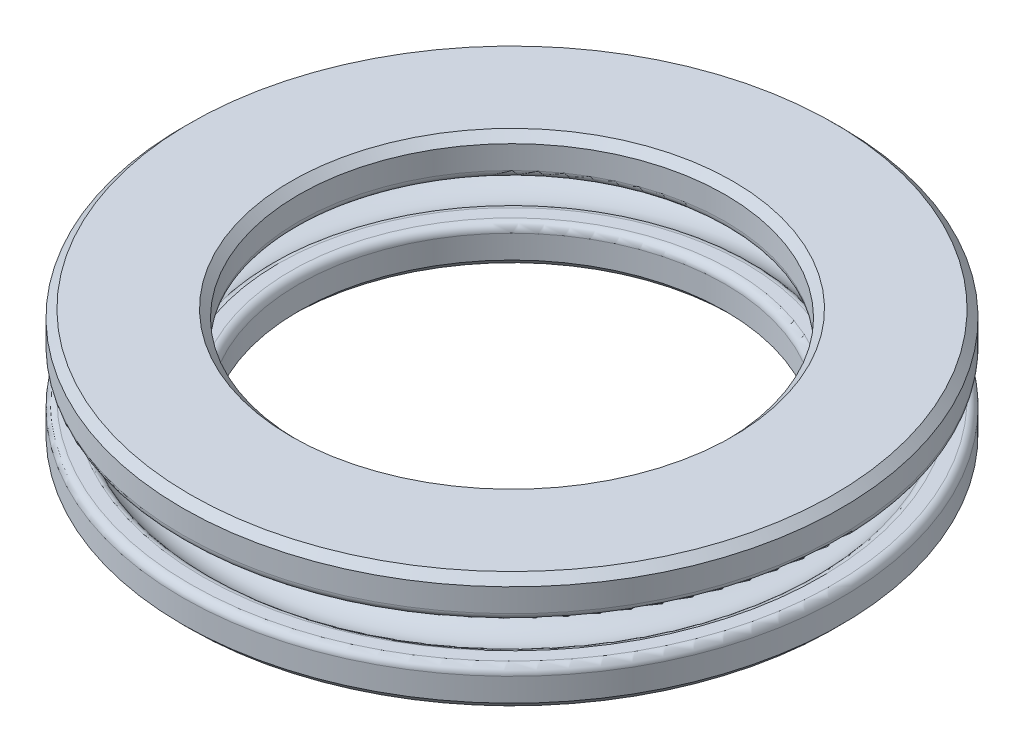
ISO-10303-21;
HEADER;
FILE_DESCRIPTION(('STEP AP214'),'2;1');
FILE_NAME('part.step','',(''),(''),'','','');
FILE_SCHEMA(('AUTOMOTIVE_DESIGN { 1 0 10303 214 1 1 1 1 }'));
ENDSEC;
DATA;
#1=APPLICATION_CONTEXT('core data for automotive mechanical design processes');
#2=APPLICATION_PROTOCOL_DEFINITION('international standard','automotive_design',2000,#1);
#3=PRODUCT_CONTEXT('',#1,'mechanical');
#4=PRODUCT('Part','Part','',(#3));
#5=PRODUCT_RELATED_PRODUCT_CATEGORY('part','',(#4));
#6=PRODUCT_DEFINITION_FORMATION('','',#4);
#7=PRODUCT_DEFINITION_CONTEXT('part definition',#1,'design');
#8=PRODUCT_DEFINITION('design','',#6,#7);
#9=PRODUCT_DEFINITION_SHAPE('','',#8);
#10=(LENGTH_UNIT() NAMED_UNIT(*) SI_UNIT(.MILLI.,.METRE.));
#11=(NAMED_UNIT(*) PLANE_ANGLE_UNIT() SI_UNIT($,.RADIAN.));
#12=(NAMED_UNIT(*) SI_UNIT($,.STERADIAN.) SOLID_ANGLE_UNIT());
#13=UNCERTAINTY_MEASURE_WITH_UNIT(LENGTH_MEASURE(1.E-05),#10,'distance_accuracy_value','');
#14=(GEOMETRIC_REPRESENTATION_CONTEXT(3) GLOBAL_UNCERTAINTY_ASSIGNED_CONTEXT((#13)) GLOBAL_UNIT_ASSIGNED_CONTEXT((#10,
#11,#12)) REPRESENTATION_CONTEXT('',''));
#15=CARTESIAN_POINT('',(0.,0.,0.));
#16=DIRECTION('',(0.,0.,1.));
#17=DIRECTION('',(1.,0.,0.));
#18=AXIS2_PLACEMENT_3D('',#15,#16,#17);
#19=CARTESIAN_POINT('',(0.,4.,0.));
#20=DIRECTION('',(0.,1.,0.));
#21=DIRECTION('',(0.,0.,1.));
#22=AXIS2_PLACEMENT_3D('',#19,#20,#21);
#23=TOROIDAL_SURFACE('',#22,30.1266028275955,1.);
#24=CARTESIAN_POINT('',(0.,4.58333333333333,0.));
#25=DIRECTION('',(0.,1.,0.));
#26=DIRECTION('',(0.,0.,1.));
#27=AXIS2_PLACEMENT_3D('',#24,#25,#26);
#28=CIRCLE('',#27,30.9388356896629);
#29=CARTESIAN_POINT('',(0.,4.58333333333333,30.9388356896629));
#30=VERTEX_POINT('',#29);
#31=EDGE_CURVE('E76',#30,#30,#28,.T.);
#32=ORIENTED_EDGE('',*,*,#31,.T.);
#33=EDGE_LOOP('',(#32));
#34=FACE_BOUND('',#33,.T.);
#35=CARTESIAN_POINT('',(0.,5.,0.));
#36=DIRECTION('',(0.,1.,0.));
#37=DIRECTION('',(0.,0.,1.));
#38=AXIS2_PLACEMENT_3D('',#35,#36,#37);
#39=CIRCLE('',#38,30.1266028275955);
#40=CARTESIAN_POINT('',(0.,5.,30.1266028275955));
#41=VERTEX_POINT('',#40);
#42=EDGE_CURVE('E11',#41,#41,#39,.T.);
#43=ORIENTED_EDGE('',*,*,#42,.F.);
#44=EDGE_LOOP('',(#43));
#45=FACE_BOUND('',#44,.T.);
#46=ADVANCED_FACE('F36',(#34,#45),#23,.T.);
#47=CARTESIAN_POINT('',(-30.1266028275955,5.,0.));
#48=DIRECTION('',(0.,1.,0.));
#49=DIRECTION('',(0.,0.,1.));
#50=AXIS2_PLACEMENT_3D('',#47,#48,#49);
#51=PLANE('',#50);
#52=ORIENTED_EDGE('',*,*,#42,.T.);
#53=EDGE_LOOP('',(#52));
#54=FACE_BOUND('',#53,.T.);
#55=CARTESIAN_POINT('',(0.,5.,0.));
#56=DIRECTION('',(0.,1.,0.));
#57=DIRECTION('',(0.,0.,1.));
#58=AXIS2_PLACEMENT_3D('',#55,#56,#57);
#59=CIRCLE('',#58,28.5);
#60=CARTESIAN_POINT('',(0.,5.,28.5));
#61=VERTEX_POINT('',#60);
#62=EDGE_CURVE('E42',#61,#61,#59,.T.);
#63=ORIENTED_EDGE('',*,*,#62,.F.);
#64=EDGE_LOOP('',(#63));
#65=FACE_BOUND('',#64,.T.);
#66=ADVANCED_FACE('F94',(#54,#65),#51,.T.);
#67=CARTESIAN_POINT('',(0.,4.,0.));
#68=DIRECTION('',(0.,1.,0.));
#69=DIRECTION('',(0.,0.,1.));
#70=AXIS2_PLACEMENT_3D('',#67,#68,#69);
#71=TOROIDAL_SURFACE('',#70,28.5,1.);
#72=ORIENTED_EDGE('',*,*,#62,.T.);
#73=EDGE_LOOP('',(#72));
#74=FACE_BOUND('',#73,.T.);
#75=CARTESIAN_POINT('',(0.,3.99999999999999,0.));
#76=DIRECTION('',(0.,1.,0.));
#77=DIRECTION('',(0.,0.,1.));
#78=AXIS2_PLACEMENT_3D('',#75,#76,#77);
#79=CIRCLE('',#78,27.5);
#80=CARTESIAN_POINT('',(0.,3.99999999999999,27.5));
#81=VERTEX_POINT('',#80);
#82=EDGE_CURVE('E46',#81,#81,#79,.T.);
#83=ORIENTED_EDGE('',*,*,#82,.F.);
#84=EDGE_LOOP('',(#83));
#85=FACE_BOUND('',#84,.T.);
#86=ADVANCED_FACE('F98',(#74,#85),#71,.T.);
#87=CARTESIAN_POINT('',(0.,36.5523015645649,0.));
#88=DIRECTION('',(0.,1.,0.));
#89=DIRECTION('',(0.,0.,1.));
#90=AXIS2_PLACEMENT_3D('',#87,#88,#89);
#91=CYLINDRICAL_SURFACE('',#90,27.5);
#92=ORIENTED_EDGE('',*,*,#82,.T.);
#93=EDGE_LOOP('',(#92));
#94=FACE_BOUND('',#93,.T.);
#95=CARTESIAN_POINT('',(0.,1.,0.));
#96=DIRECTION('',(0.,1.,0.));
#97=DIRECTION('',(0.,0.,1.));
#98=AXIS2_PLACEMENT_3D('',#95,#96,#97);
#99=CIRCLE('',#98,27.5);
#100=CARTESIAN_POINT('',(0.,1.,27.5));
#101=VERTEX_POINT('',#100);
#102=EDGE_CURVE('E50',#101,#101,#99,.T.);
#103=ORIENTED_EDGE('',*,*,#102,.F.);
#104=EDGE_LOOP('',(#103));
#105=FACE_BOUND('',#104,.T.);
#106=ADVANCED_FACE('F102',(#94,#105),#91,.F.);
#107=CARTESIAN_POINT('',(0.,0.,0.));
#108=DIRECTION('',(0.,-1.,0.));
#109=DIRECTION('',(0.,0.,-1.));
#110=AXIS2_PLACEMENT_3D('',#107,#108,#109);
#111=CONICAL_SURFACE('',#110,28.5,0.785398163397448);
#112=ORIENTED_EDGE('',*,*,#102,.T.);
#113=EDGE_LOOP('',(#112));
#114=FACE_BOUND('',#113,.T.);
#115=CARTESIAN_POINT('',(0.,0.,0.));
#116=DIRECTION('',(0.,1.,0.));
#117=DIRECTION('',(0.,0.,1.));
#118=AXIS2_PLACEMENT_3D('',#115,#116,#117);
#119=CIRCLE('',#118,28.5);
#120=CARTESIAN_POINT('',(0.,0.,28.5));
#121=VERTEX_POINT('',#120);
#122=EDGE_CURVE('E55',#121,#121,#119,.T.);
#123=ORIENTED_EDGE('',*,*,#122,.F.);
#124=EDGE_LOOP('',(#123));
#125=FACE_BOUND('',#124,.T.);
#126=ADVANCED_FACE('F108',(#114,#125),#111,.F.);
#127=CARTESIAN_POINT('',(-41.5,0.,0.));
#128=DIRECTION('',(0.,-1.,0.));
#129=DIRECTION('',(0.,0.,-1.));
#130=AXIS2_PLACEMENT_3D('',#127,#128,#129);
#131=PLANE('',#130);
#132=ORIENTED_EDGE('',*,*,#122,.T.);
#133=EDGE_LOOP('',(#132));
#134=FACE_BOUND('',#133,.T.);
#135=CARTESIAN_POINT('',(0.,0.,0.));
#136=DIRECTION('',(0.,1.,0.));
#137=DIRECTION('',(0.,0.,1.));
#138=AXIS2_PLACEMENT_3D('',#135,#136,#137);
#139=CIRCLE('',#138,41.5);
#140=CARTESIAN_POINT('',(0.,0.,41.5));
#141=VERTEX_POINT('',#140);
#142=EDGE_CURVE('E58',#141,#141,#139,.T.);
#143=ORIENTED_EDGE('',*,*,#142,.F.);
#144=EDGE_LOOP('',(#143));
#145=FACE_BOUND('',#144,.T.);
#146=ADVANCED_FACE('F112',(#134,#145),#131,.T.);
#147=CARTESIAN_POINT('',(0.,1.,0.));
#148=DIRECTION('',(0.,1.,0.));
#149=DIRECTION('',(0.,0.,1.));
#150=AXIS2_PLACEMENT_3D('',#147,#148,#149);
#151=CONICAL_SURFACE('',#150,42.5,0.785398163397448);
#152=ORIENTED_EDGE('',*,*,#142,.T.);
#153=EDGE_LOOP('',(#152));
#154=FACE_BOUND('',#153,.T.);
#155=CARTESIAN_POINT('',(0.,1.,0.));
#156=DIRECTION('',(0.,1.,0.));
#157=DIRECTION('',(0.,0.,1.));
#158=AXIS2_PLACEMENT_3D('',#155,#156,#157);
#159=CIRCLE('',#158,42.5);
#160=CARTESIAN_POINT('',(0.,1.,42.5));
#161=VERTEX_POINT('',#160);
#162=EDGE_CURVE('E61',#161,#161,#159,.T.);
#163=ORIENTED_EDGE('',*,*,#162,.F.);
#164=EDGE_LOOP('',(#163));
#165=FACE_BOUND('',#164,.T.);
#166=ADVANCED_FACE('F116',(#154,#165),#151,.T.);
#167=CARTESIAN_POINT('',(0.,36.5523015645649,0.));
#168=DIRECTION('',(0.,1.,0.));
#169=DIRECTION('',(0.,0.,1.));
#170=AXIS2_PLACEMENT_3D('',#167,#168,#169);
#171=CYLINDRICAL_SURFACE('',#170,42.5);
#172=ORIENTED_EDGE('',*,*,#162,.T.);
#173=EDGE_LOOP('',(#172));
#174=FACE_BOUND('',#173,.T.);
#175=CARTESIAN_POINT('',(0.,3.99999999999999,0.));
#176=DIRECTION('',(0.,1.,0.));
#177=DIRECTION('',(0.,0.,1.));
#178=AXIS2_PLACEMENT_3D('',#175,#176,#177);
#179=CIRCLE('',#178,42.5);
#180=CARTESIAN_POINT('',(0.,3.99999999999999,42.5));
#181=VERTEX_POINT('',#180);
#182=EDGE_CURVE('E64',#181,#181,#179,.T.);
#183=ORIENTED_EDGE('',*,*,#182,.F.);
#184=EDGE_LOOP('',(#183));
#185=FACE_BOUND('',#184,.T.);
#186=ADVANCED_FACE('F120',(#174,#185),#171,.T.);
#187=CARTESIAN_POINT('',(0.,4.,0.));
#188=DIRECTION('',(0.,1.,0.));
#189=DIRECTION('',(0.,0.,1.));
#190=AXIS2_PLACEMENT_3D('',#187,#188,#189);
#191=TOROIDAL_SURFACE('',#190,41.5,1.);
#192=ORIENTED_EDGE('',*,*,#182,.T.);
#193=EDGE_LOOP('',(#192));
#194=FACE_BOUND('',#193,.T.);
#195=CARTESIAN_POINT('',(0.,5.,0.));
#196=DIRECTION('',(0.,1.,0.));
#197=DIRECTION('',(0.,0.,1.));
#198=AXIS2_PLACEMENT_3D('',#195,#196,#197);
#199=CIRCLE('',#198,41.5);
#200=CARTESIAN_POINT('',(0.,5.,41.5));
#201=VERTEX_POINT('',#200);
#202=EDGE_CURVE('E67',#201,#201,#199,.T.);
#203=ORIENTED_EDGE('',*,*,#202,.F.);
#204=EDGE_LOOP('',(#203));
#205=FACE_BOUND('',#204,.T.);
#206=ADVANCED_FACE('F124',(#194,#205),#191,.T.);
#207=CARTESIAN_POINT('',(-41.5,5.,0.));
#208=DIRECTION('',(0.,1.,0.));
#209=DIRECTION('',(0.,0.,1.));
#210=AXIS2_PLACEMENT_3D('',#207,#208,#209);
#211=PLANE('',#210);
#212=ORIENTED_EDGE('',*,*,#202,.T.);
#213=EDGE_LOOP('',(#212));
#214=FACE_BOUND('',#213,.T.);
#215=CARTESIAN_POINT('',(0.,5.,0.));
#216=DIRECTION('',(0.,1.,0.));
#217=DIRECTION('',(0.,0.,1.));
#218=AXIS2_PLACEMENT_3D('',#215,#216,#217);
#219=CIRCLE('',#218,39.8733971724045);
#220=CARTESIAN_POINT('',(0.,5.,39.8733971724045));
#221=VERTEX_POINT('',#220);
#222=EDGE_CURVE('E70',#221,#221,#219,.T.);
#223=ORIENTED_EDGE('',*,*,#222,.F.);
#224=EDGE_LOOP('',(#223));
#225=FACE_BOUND('',#224,.T.);
#226=ADVANCED_FACE('F90',(#214,#225),#211,.T.);
#227=CARTESIAN_POINT('',(0.,4.,0.));
#228=DIRECTION('',(0.,1.,0.));
#229=DIRECTION('',(0.,0.,1.));
#230=AXIS2_PLACEMENT_3D('',#227,#228,#229);
#231=TOROIDAL_SURFACE('',#230,39.8733971724045,1.);
#232=ORIENTED_EDGE('',*,*,#222,.T.);
#233=EDGE_LOOP('',(#232));
#234=FACE_BOUND('',#233,.T.);
#235=CARTESIAN_POINT('',(0.,4.58333333333333,0.));
#236=DIRECTION('',(0.,1.,0.));
#237=DIRECTION('',(0.,0.,1.));
#238=AXIS2_PLACEMENT_3D('',#235,#236,#237);
#239=CIRCLE('',#238,39.0611643103371);
#240=CARTESIAN_POINT('',(0.,4.58333333333333,39.0611643103371));
#241=VERTEX_POINT('',#240);
#242=EDGE_CURVE('E73',#241,#241,#239,.T.);
#243=ORIENTED_EDGE('',*,*,#242,.F.);
#244=EDGE_LOOP('',(#243));
#245=FACE_BOUND('',#244,.T.);
#246=ADVANCED_FACE('F84',(#234,#245),#231,.T.);
#247=CARTESIAN_POINT('',(0.,7.5,0.));
#248=DIRECTION('',(0.,1.,0.));
#249=DIRECTION('',(0.,0.,1.));
#250=AXIS2_PLACEMENT_3D('',#247,#248,#249);
#251=TOROIDAL_SURFACE('',#250,35.,5.);
#252=ORIENTED_EDGE('',*,*,#242,.T.);
#253=EDGE_LOOP('',(#252));
#254=FACE_BOUND('',#253,.T.);
#255=ORIENTED_EDGE('',*,*,#31,.F.);
#256=EDGE_LOOP('',(#255));
#257=FACE_BOUND('',#256,.T.);
#258=ADVANCED_FACE('F82',(#254,#257),#251,.F.);
#259=CLOSED_SHELL('',(#46,#66,#86,#106,#126,#146,#166,#186,#206,#226,#246,#258));
#260=MANIFOLD_SOLID_BREP('B2',#259);
#261=CARTESIAN_POINT('',(0.,11.,0.));
#262=DIRECTION('',(0.,1.,0.));
#263=DIRECTION('',(0.,0.,1.));
#264=AXIS2_PLACEMENT_3D('',#261,#262,#263);
#265=TOROIDAL_SURFACE('',#264,41.5,1.);
#266=CARTESIAN_POINT('',(0.,10.,0.));
#267=DIRECTION('',(0.,1.,0.));
#268=DIRECTION('',(0.,0.,1.));
#269=AXIS2_PLACEMENT_3D('',#266,#267,#268);
#270=CIRCLE('',#269,41.5);
#271=CARTESIAN_POINT('',(0.,10.,41.5));
#272=VERTEX_POINT('',#271);
#273=EDGE_CURVE('E35',#272,#272,#270,.T.);
#274=ORIENTED_EDGE('',*,*,#273,.T.);
#275=EDGE_LOOP('',(#274));
#276=FACE_BOUND('',#275,.T.);
#277=CARTESIAN_POINT('',(0.,11.,0.));
#278=DIRECTION('',(0.,1.,0.));
#279=DIRECTION('',(0.,0.,1.));
#280=AXIS2_PLACEMENT_3D('',#277,#278,#279);
#281=CIRCLE('',#280,42.5);
#282=CARTESIAN_POINT('',(0.,11.,42.5));
#283=VERTEX_POINT('',#282);
#284=EDGE_CURVE('E257',#283,#283,#281,.T.);
#285=ORIENTED_EDGE('',*,*,#284,.F.);
#286=EDGE_LOOP('',(#285));
#287=FACE_BOUND('',#286,.T.);
#288=ADVANCED_FACE('F217',(#276,#287),#265,.T.);
#289=CARTESIAN_POINT('',(-41.5,10.,0.));
#290=DIRECTION('',(0.,-1.,0.));
#291=DIRECTION('',(0.,0.,-1.));
#292=AXIS2_PLACEMENT_3D('',#289,#290,#291);
#293=PLANE('',#292);
#294=CARTESIAN_POINT('',(0.,10.,0.));
#295=DIRECTION('',(0.,1.,0.));
#296=DIRECTION('',(0.,0.,1.));
#297=AXIS2_PLACEMENT_3D('',#294,#295,#296);
#298=CIRCLE('',#297,39.8733971724045);
#299=CARTESIAN_POINT('',(0.,10.,39.8733971724045));
#300=VERTEX_POINT('',#299);
#301=EDGE_CURVE('E223',#300,#300,#298,.T.);
#302=ORIENTED_EDGE('',*,*,#301,.T.);
#303=EDGE_LOOP('',(#302));
#304=FACE_BOUND('',#303,.T.);
#305=ORIENTED_EDGE('',*,*,#273,.F.);
#306=EDGE_LOOP('',(#305));
#307=FACE_BOUND('',#306,.T.);
#308=ADVANCED_FACE('F265',(#304,#307),#293,.T.);
#309=CARTESIAN_POINT('',(0.,11.,0.));
#310=DIRECTION('',(0.,1.,0.));
#311=DIRECTION('',(0.,0.,1.));
#312=AXIS2_PLACEMENT_3D('',#309,#310,#311);
#313=TOROIDAL_SURFACE('',#312,39.8733971724045,1.);
#314=CARTESIAN_POINT('',(0.,10.4166666666667,0.));
#315=DIRECTION('',(0.,1.,0.));
#316=DIRECTION('',(0.,0.,1.));
#317=AXIS2_PLACEMENT_3D('',#314,#315,#316);
#318=CIRCLE('',#317,39.0611643103371);
#319=CARTESIAN_POINT('',(0.,10.4166666666667,39.0611643103371));
#320=VERTEX_POINT('',#319);
#321=EDGE_CURVE('E227',#320,#320,#318,.T.);
#322=ORIENTED_EDGE('',*,*,#321,.T.);
#323=EDGE_LOOP('',(#322));
#324=FACE_BOUND('',#323,.T.);
#325=ORIENTED_EDGE('',*,*,#301,.F.);
#326=EDGE_LOOP('',(#325));
#327=FACE_BOUND('',#326,.T.);
#328=ADVANCED_FACE('F269',(#324,#327),#313,.T.);
#329=CARTESIAN_POINT('',(0.,7.5,0.));
#330=DIRECTION('',(0.,1.,0.));
#331=DIRECTION('',(0.,0.,1.));
#332=AXIS2_PLACEMENT_3D('',#329,#330,#331);
#333=TOROIDAL_SURFACE('',#332,35.,5.);
#334=CARTESIAN_POINT('',(0.,10.4166666666667,0.));
#335=DIRECTION('',(0.,1.,0.));
#336=DIRECTION('',(0.,0.,1.));
#337=AXIS2_PLACEMENT_3D('',#334,#335,#336);
#338=CIRCLE('',#337,30.9388356896629);
#339=CARTESIAN_POINT('',(0.,10.4166666666667,30.9388356896629));
#340=VERTEX_POINT('',#339);
#341=EDGE_CURVE('E231',#340,#340,#338,.T.);
#342=ORIENTED_EDGE('',*,*,#341,.T.);
#343=EDGE_LOOP('',(#342));
#344=FACE_BOUND('',#343,.T.);
#345=ORIENTED_EDGE('',*,*,#321,.F.);
#346=EDGE_LOOP('',(#345));
#347=FACE_BOUND('',#346,.T.);
#348=ADVANCED_FACE('F273',(#344,#347),#333,.F.);
#349=CARTESIAN_POINT('',(0.,11.,0.));
#350=DIRECTION('',(0.,1.,0.));
#351=DIRECTION('',(0.,0.,1.));
#352=AXIS2_PLACEMENT_3D('',#349,#350,#351);
#353=TOROIDAL_SURFACE('',#352,30.1266028275955,1.);
#354=CARTESIAN_POINT('',(0.,10.,0.));
#355=DIRECTION('',(0.,1.,0.));
#356=DIRECTION('',(0.,0.,1.));
#357=AXIS2_PLACEMENT_3D('',#354,#355,#356);
#358=CIRCLE('',#357,30.1266028275955);
#359=CARTESIAN_POINT('',(0.,10.,30.1266028275955));
#360=VERTEX_POINT('',#359);
#361=EDGE_CURVE('E236',#360,#360,#358,.T.);
#362=ORIENTED_EDGE('',*,*,#361,.T.);
#363=EDGE_LOOP('',(#362));
#364=FACE_BOUND('',#363,.T.);
#365=ORIENTED_EDGE('',*,*,#341,.F.);
#366=EDGE_LOOP('',(#365));
#367=FACE_BOUND('',#366,.T.);
#368=ADVANCED_FACE('F280',(#364,#367),#353,.T.);
#369=CARTESIAN_POINT('',(-30.1266028275955,10.,0.));
#370=DIRECTION('',(0.,-1.,0.));
#371=DIRECTION('',(0.,0.,-1.));
#372=AXIS2_PLACEMENT_3D('',#369,#370,#371);
#373=PLANE('',#372);
#374=CARTESIAN_POINT('',(0.,10.,0.));
#375=DIRECTION('',(0.,1.,0.));
#376=DIRECTION('',(0.,0.,1.));
#377=AXIS2_PLACEMENT_3D('',#374,#375,#376);
#378=CIRCLE('',#377,28.5);
#379=CARTESIAN_POINT('',(0.,10.,28.5));
#380=VERTEX_POINT('',#379);
#381=EDGE_CURVE('E239',#380,#380,#378,.T.);
#382=ORIENTED_EDGE('',*,*,#381,.T.);
#383=EDGE_LOOP('',(#382));
#384=FACE_BOUND('',#383,.T.);
#385=ORIENTED_EDGE('',*,*,#361,.F.);
#386=EDGE_LOOP('',(#385));
#387=FACE_BOUND('',#386,.T.);
#388=ADVANCED_FACE('F284',(#384,#387),#373,.T.);
#389=CARTESIAN_POINT('',(0.,11.,0.));
#390=DIRECTION('',(0.,1.,0.));
#391=DIRECTION('',(0.,0.,1.));
#392=AXIS2_PLACEMENT_3D('',#389,#390,#391);
#393=TOROIDAL_SURFACE('',#392,28.5,1.);
#394=CARTESIAN_POINT('',(0.,11.,0.));
#395=DIRECTION('',(0.,1.,0.));
#396=DIRECTION('',(0.,0.,1.));
#397=AXIS2_PLACEMENT_3D('',#394,#395,#396);
#398=CIRCLE('',#397,27.5);
#399=CARTESIAN_POINT('',(0.,11.,27.5));
#400=VERTEX_POINT('',#399);
#401=EDGE_CURVE('E242',#400,#400,#398,.T.);
#402=ORIENTED_EDGE('',*,*,#401,.T.);
#403=EDGE_LOOP('',(#402));
#404=FACE_BOUND('',#403,.T.);
#405=ORIENTED_EDGE('',*,*,#381,.F.);
#406=EDGE_LOOP('',(#405));
#407=FACE_BOUND('',#406,.T.);
#408=ADVANCED_FACE('F288',(#404,#407),#393,.T.);
#409=CARTESIAN_POINT('',(0.,36.5523015645649,0.));
#410=DIRECTION('',(0.,1.,0.));
#411=DIRECTION('',(0.,0.,1.));
#412=AXIS2_PLACEMENT_3D('',#409,#410,#411);
#413=CYLINDRICAL_SURFACE('',#412,27.5);
#414=CARTESIAN_POINT('',(0.,14.,0.));
#415=DIRECTION('',(0.,1.,0.));
#416=DIRECTION('',(0.,0.,1.));
#417=AXIS2_PLACEMENT_3D('',#414,#415,#416);
#418=CIRCLE('',#417,27.5);
#419=CARTESIAN_POINT('',(0.,14.,27.5));
#420=VERTEX_POINT('',#419);
#421=EDGE_CURVE('E245',#420,#420,#418,.T.);
#422=ORIENTED_EDGE('',*,*,#421,.T.);
#423=EDGE_LOOP('',(#422));
#424=FACE_BOUND('',#423,.T.);
#425=ORIENTED_EDGE('',*,*,#401,.F.);
#426=EDGE_LOOP('',(#425));
#427=FACE_BOUND('',#426,.T.);
#428=ADVANCED_FACE('F292',(#424,#427),#413,.F.);
#429=CARTESIAN_POINT('',(0.,14.,0.));
#430=DIRECTION('',(0.,1.,0.));
#431=DIRECTION('',(0.,0.,1.));
#432=AXIS2_PLACEMENT_3D('',#429,#430,#431);
#433=CONICAL_SURFACE('',#432,27.5,0.785398163397448);
#434=CARTESIAN_POINT('',(0.,15.,0.));
#435=DIRECTION('',(0.,1.,0.));
#436=DIRECTION('',(0.,0.,1.));
#437=AXIS2_PLACEMENT_3D('',#434,#435,#436);
#438=CIRCLE('',#437,28.5);
#439=CARTESIAN_POINT('',(0.,15.,28.5));
#440=VERTEX_POINT('',#439);
#441=EDGE_CURVE('E248',#440,#440,#438,.T.);
#442=ORIENTED_EDGE('',*,*,#441,.T.);
#443=EDGE_LOOP('',(#442));
#444=FACE_BOUND('',#443,.T.);
#445=ORIENTED_EDGE('',*,*,#421,.F.);
#446=EDGE_LOOP('',(#445));
#447=FACE_BOUND('',#446,.T.);
#448=ADVANCED_FACE('F296',(#444,#447),#433,.F.);
#449=CARTESIAN_POINT('',(-41.5,15.,0.));
#450=DIRECTION('',(0.,1.,0.));
#451=DIRECTION('',(0.,0.,1.));
#452=AXIS2_PLACEMENT_3D('',#449,#450,#451);
#453=PLANE('',#452);
#454=CARTESIAN_POINT('',(0.,15.,0.));
#455=DIRECTION('',(0.,1.,0.));
#456=DIRECTION('',(0.,0.,1.));
#457=AXIS2_PLACEMENT_3D('',#454,#455,#456);
#458=CIRCLE('',#457,41.5);
#459=CARTESIAN_POINT('',(0.,15.,41.5));
#460=VERTEX_POINT('',#459);
#461=EDGE_CURVE('E251',#460,#460,#458,.T.);
#462=ORIENTED_EDGE('',*,*,#461,.T.);
#463=EDGE_LOOP('',(#462));
#464=FACE_BOUND('',#463,.T.);
#465=ORIENTED_EDGE('',*,*,#441,.F.);
#466=EDGE_LOOP('',(#465));
#467=FACE_BOUND('',#466,.T.);
#468=ADVANCED_FACE('F300',(#464,#467),#453,.T.);
#469=CARTESIAN_POINT('',(0.,15.,0.));
#470=DIRECTION('',(0.,-1.,0.));
#471=DIRECTION('',(0.,0.,-1.));
#472=AXIS2_PLACEMENT_3D('',#469,#470,#471);
#473=CONICAL_SURFACE('',#472,41.5,0.785398163397448);
#474=CARTESIAN_POINT('',(0.,14.,0.));
#475=DIRECTION('',(0.,1.,0.));
#476=DIRECTION('',(0.,0.,1.));
#477=AXIS2_PLACEMENT_3D('',#474,#475,#476);
#478=CIRCLE('',#477,42.5);
#479=CARTESIAN_POINT('',(0.,14.,42.5));
#480=VERTEX_POINT('',#479);
#481=EDGE_CURVE('E254',#480,#480,#478,.T.);
#482=ORIENTED_EDGE('',*,*,#481,.T.);
#483=EDGE_LOOP('',(#482));
#484=FACE_BOUND('',#483,.T.);
#485=ORIENTED_EDGE('',*,*,#461,.F.);
#486=EDGE_LOOP('',(#485));
#487=FACE_BOUND('',#486,.T.);
#488=ADVANCED_FACE('F304',(#484,#487),#473,.T.);
#489=CARTESIAN_POINT('',(0.,36.5523015645649,0.));
#490=DIRECTION('',(0.,1.,0.));
#491=DIRECTION('',(0.,0.,1.));
#492=AXIS2_PLACEMENT_3D('',#489,#490,#491);
#493=CYLINDRICAL_SURFACE('',#492,42.5);
#494=ORIENTED_EDGE('',*,*,#284,.T.);
#495=EDGE_LOOP('',(#494));
#496=FACE_BOUND('',#495,.T.);
#497=ORIENTED_EDGE('',*,*,#481,.F.);
#498=EDGE_LOOP('',(#497));
#499=FACE_BOUND('',#498,.T.);
#500=ADVANCED_FACE('F261',(#496,#499),#493,.T.);
#501=CLOSED_SHELL('',(#288,#308,#328,#348,#368,#388,#408,#428,#448,#468,#488,#500));
#502=MANIFOLD_SOLID_BREP('B6',#501);
#503=ADVANCED_BREP_SHAPE_REPRESENTATION('',(#18,#260,#502),#14);
#504=SHAPE_DEFINITION_REPRESENTATION(#9,#503);
ENDSEC;
END-ISO-10303-21;
